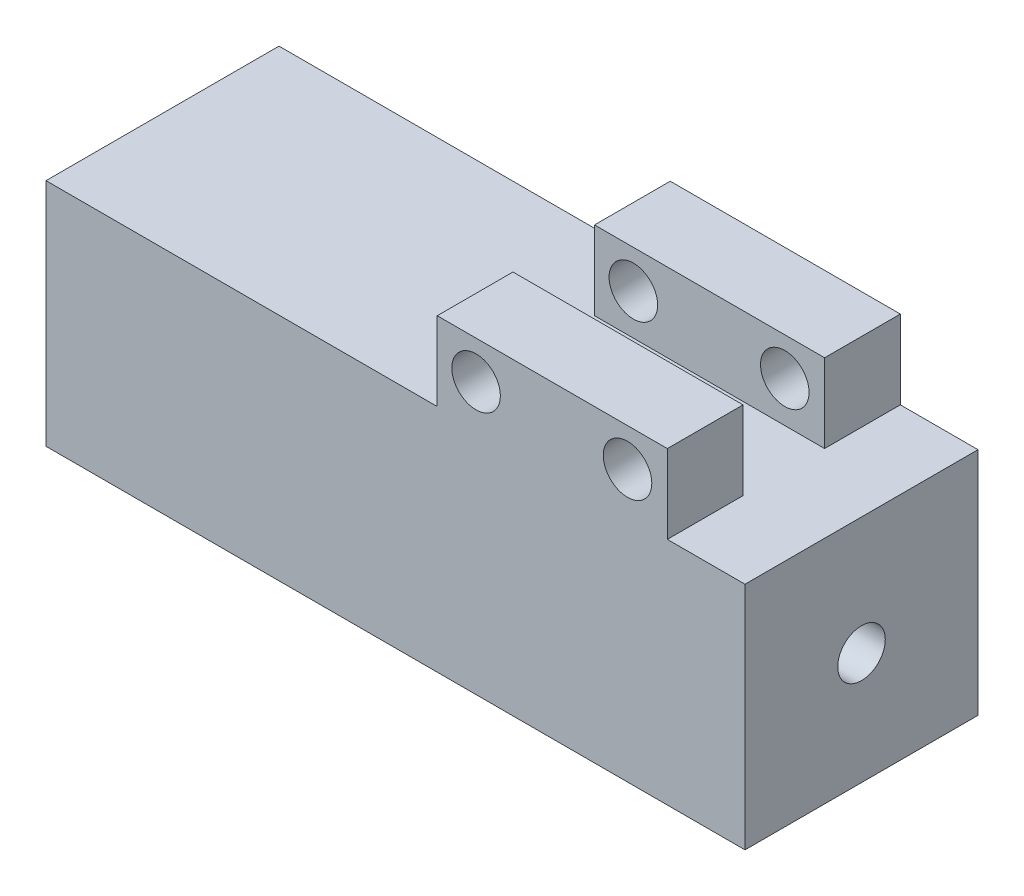
ISO-10303-21;
HEADER;
FILE_DESCRIPTION(('STEP AP214'),'2;1');
FILE_NAME('part.step','',(''),(''),'','','');
FILE_SCHEMA(('AUTOMOTIVE_DESIGN { 1 0 10303 214 1 1 1 1 }'));
ENDSEC;
DATA;
#1=APPLICATION_CONTEXT('core data for automotive mechanical design processes');
#2=APPLICATION_PROTOCOL_DEFINITION('international standard','automotive_design',2000,#1);
#3=PRODUCT_CONTEXT('',#1,'mechanical');
#4=PRODUCT('Part','Part','',(#3));
#5=PRODUCT_RELATED_PRODUCT_CATEGORY('part','',(#4));
#6=PRODUCT_DEFINITION_FORMATION('','',#4);
#7=PRODUCT_DEFINITION_CONTEXT('part definition',#1,'design');
#8=PRODUCT_DEFINITION('design','',#6,#7);
#9=PRODUCT_DEFINITION_SHAPE('','',#8);
#10=(LENGTH_UNIT() NAMED_UNIT(*) SI_UNIT(.MILLI.,.METRE.));
#11=(NAMED_UNIT(*) PLANE_ANGLE_UNIT() SI_UNIT($,.RADIAN.));
#12=(NAMED_UNIT(*) SI_UNIT($,.STERADIAN.) SOLID_ANGLE_UNIT());
#13=UNCERTAINTY_MEASURE_WITH_UNIT(LENGTH_MEASURE(1.E-05),#10,'distance_accuracy_value','');
#14=(GEOMETRIC_REPRESENTATION_CONTEXT(3) GLOBAL_UNCERTAINTY_ASSIGNED_CONTEXT((#13)) GLOBAL_UNIT_ASSIGNED_CONTEXT((#10,
#11,#12)) REPRESENTATION_CONTEXT('',''));
#15=CARTESIAN_POINT('',(0.,0.,0.));
#16=DIRECTION('',(0.,0.,1.));
#17=DIRECTION('',(1.,0.,0.));
#18=AXIS2_PLACEMENT_3D('',#15,#16,#17);
#19=CARTESIAN_POINT('',(-36.,11.85,12.));
#20=DIRECTION('',(0.,-1.,0.));
#21=DIRECTION('',(0.,0.,-1.));
#22=AXIS2_PLACEMENT_3D('',#19,#20,#21);
#23=PLANE('',#22);
#24=DIRECTION('',(0.,0.,1.));
#25=VECTOR('',#24,1.);
#26=CARTESIAN_POINT('',(4.3,11.85,-12.));
#27=LINE('',#26,#25);
#28=CARTESIAN_POINT('',(4.3,11.85,-12.));
#29=VERTEX_POINT('',#28);
#30=CARTESIAN_POINT('',(4.3,11.85,-4.2));
#31=VERTEX_POINT('',#30);
#32=EDGE_CURVE('E149',#29,#31,#27,.T.);
#33=ORIENTED_EDGE('',*,*,#32,.F.);
#34=DIRECTION('',(-1.,0.,0.));
#35=VECTOR('',#34,1.);
#36=CARTESIAN_POINT('',(-36.,11.85,-12.));
#37=LINE('',#36,#35);
#38=CARTESIAN_POINT('',(-36.,11.85,-12.));
#39=VERTEX_POINT('',#38);
#40=EDGE_CURVE('E134',#29,#39,#37,.T.);
#41=ORIENTED_EDGE('',*,*,#40,.T.);
#42=DIRECTION('',(0.,0.,-1.));
#43=VECTOR('',#42,1.);
#44=CARTESIAN_POINT('',(-36.,11.85,12.));
#45=LINE('',#44,#43);
#46=CARTESIAN_POINT('',(-36.,11.85,12.));
#47=VERTEX_POINT('',#46);
#48=EDGE_CURVE('E237',#47,#39,#45,.T.);
#49=ORIENTED_EDGE('',*,*,#48,.F.);
#50=DIRECTION('',(-1.,0.,0.));
#51=VECTOR('',#50,1.);
#52=CARTESIAN_POINT('',(-36.,11.85,12.));
#53=LINE('',#52,#51);
#54=CARTESIAN_POINT('',(4.3,11.85,12.));
#55=VERTEX_POINT('',#54);
#56=EDGE_CURVE('E232',#55,#47,#53,.T.);
#57=ORIENTED_EDGE('',*,*,#56,.F.);
#58=DIRECTION('',(0.,0.,1.));
#59=VECTOR('',#58,1.);
#60=CARTESIAN_POINT('',(4.3,11.85,12.));
#61=LINE('',#60,#59);
#62=CARTESIAN_POINT('',(4.3,11.85,4.2));
#63=VERTEX_POINT('',#62);
#64=EDGE_CURVE('E153',#63,#55,#61,.T.);
#65=ORIENTED_EDGE('',*,*,#64,.F.);
#66=DIRECTION('',(-1.,0.,0.));
#67=VECTOR('',#66,1.);
#68=CARTESIAN_POINT('',(4.3,11.85,4.2));
#69=LINE('',#68,#67);
#70=CARTESIAN_POINT('',(28.,11.85,4.2));
#71=VERTEX_POINT('',#70);
#72=EDGE_CURVE('E187',#71,#63,#69,.T.);
#73=ORIENTED_EDGE('',*,*,#72,.F.);
#74=DIRECTION('',(0.,0.,-1.));
#75=VECTOR('',#74,1.);
#76=CARTESIAN_POINT('',(28.,11.85,12.));
#77=LINE('',#76,#75);
#78=CARTESIAN_POINT('',(28.,11.85,12.));
#79=VERTEX_POINT('',#78);
#80=EDGE_CURVE('E200',#79,#71,#77,.T.);
#81=ORIENTED_EDGE('',*,*,#80,.F.);
#82=CARTESIAN_POINT('',(36.,11.85,12.));
#83=VERTEX_POINT('',#82);
#84=EDGE_CURVE('E233',#83,#79,#53,.T.);
#85=ORIENTED_EDGE('',*,*,#84,.F.);
#86=DIRECTION('',(0.,0.,-1.));
#87=VECTOR('',#86,1.);
#88=CARTESIAN_POINT('',(36.,11.85,12.));
#89=LINE('',#88,#87);
#90=CARTESIAN_POINT('',(36.,11.85,-12.));
#91=VERTEX_POINT('',#90);
#92=EDGE_CURVE('E248',#83,#91,#89,.T.);
#93=ORIENTED_EDGE('',*,*,#92,.T.);
#94=CARTESIAN_POINT('',(28.,11.85,-12.));
#95=VERTEX_POINT('',#94);
#96=EDGE_CURVE('E145',#91,#95,#37,.T.);
#97=ORIENTED_EDGE('',*,*,#96,.T.);
#98=DIRECTION('',(0.,0.,-1.));
#99=VECTOR('',#98,1.);
#100=CARTESIAN_POINT('',(28.,11.85,-12.));
#101=LINE('',#100,#99);
#102=CARTESIAN_POINT('',(28.,11.85,-4.2));
#103=VERTEX_POINT('',#102);
#104=EDGE_CURVE('E66',#103,#95,#101,.T.);
#105=ORIENTED_EDGE('',*,*,#104,.F.);
#106=DIRECTION('',(1.,0.,0.));
#107=VECTOR('',#106,1.);
#108=CARTESIAN_POINT('',(4.3,11.85,-4.2));
#109=LINE('',#108,#107);
#110=EDGE_CURVE('E61',#31,#103,#109,.T.);
#111=ORIENTED_EDGE('',*,*,#110,.F.);
#112=EDGE_LOOP('',(#33,#41,#49,#57,#65,#73,#81,#85,#93,#97,#105,#111));
#113=FACE_BOUND('',#112,.T.);
#114=ADVANCED_FACE('F43',(#113),#23,.F.);
#115=CARTESIAN_POINT('',(-36.,-11.85,12.));
#116=DIRECTION('',(1.,0.,0.));
#117=DIRECTION('',(0.,0.,-1.));
#118=AXIS2_PLACEMENT_3D('',#115,#116,#117);
#119=PLANE('',#118);
#120=DIRECTION('',(0.,-1.,0.));
#121=VECTOR('',#120,1.);
#122=CARTESIAN_POINT('',(-36.,-11.85,-12.));
#123=LINE('',#122,#121);
#124=CARTESIAN_POINT('',(-36.,-11.85,-12.));
#125=VERTEX_POINT('',#124);
#126=EDGE_CURVE('E141',#39,#125,#123,.T.);
#127=ORIENTED_EDGE('',*,*,#126,.T.);
#128=DIRECTION('',(0.,0.,-1.));
#129=VECTOR('',#128,1.);
#130=CARTESIAN_POINT('',(-36.,-11.85,12.));
#131=LINE('',#130,#129);
#132=CARTESIAN_POINT('',(-36.,-11.85,12.));
#133=VERTEX_POINT('',#132);
#134=EDGE_CURVE('E11',#133,#125,#131,.T.);
#135=ORIENTED_EDGE('',*,*,#134,.F.);
#136=DIRECTION('',(0.,-1.,0.));
#137=VECTOR('',#136,1.);
#138=CARTESIAN_POINT('',(-36.,-11.85,12.));
#139=LINE('',#138,#137);
#140=EDGE_CURVE('E222',#47,#133,#139,.T.);
#141=ORIENTED_EDGE('',*,*,#140,.F.);
#142=ORIENTED_EDGE('',*,*,#48,.T.);
#143=EDGE_LOOP('',(#127,#135,#141,#142));
#144=FACE_BOUND('',#143,.T.);
#145=ADVANCED_FACE('F45',(#144),#119,.F.);
#146=CARTESIAN_POINT('',(-36.,-11.85,12.));
#147=DIRECTION('',(0.,1.,0.));
#148=DIRECTION('',(0.,0.,1.));
#149=AXIS2_PLACEMENT_3D('',#146,#147,#148);
#150=PLANE('',#149);
#151=DIRECTION('',(1.,0.,0.));
#152=VECTOR('',#151,1.);
#153=CARTESIAN_POINT('',(-36.,-11.85,-12.));
#154=LINE('',#153,#152);
#155=CARTESIAN_POINT('',(36.,-11.85,-12.));
#156=VERTEX_POINT('',#155);
#157=EDGE_CURVE('E240',#125,#156,#154,.T.);
#158=ORIENTED_EDGE('',*,*,#157,.T.);
#159=DIRECTION('',(0.,0.,-1.));
#160=VECTOR('',#159,1.);
#161=CARTESIAN_POINT('',(36.,-11.85,12.));
#162=LINE('',#161,#160);
#163=CARTESIAN_POINT('',(36.,-11.85,12.));
#164=VERTEX_POINT('',#163);
#165=EDGE_CURVE('E53',#164,#156,#162,.T.);
#166=ORIENTED_EDGE('',*,*,#165,.F.);
#167=DIRECTION('',(1.,0.,0.));
#168=VECTOR('',#167,1.);
#169=CARTESIAN_POINT('',(-36.,-11.85,12.));
#170=LINE('',#169,#168);
#171=EDGE_CURVE('E226',#133,#164,#170,.T.);
#172=ORIENTED_EDGE('',*,*,#171,.F.);
#173=ORIENTED_EDGE('',*,*,#134,.T.);
#174=EDGE_LOOP('',(#158,#166,#172,#173));
#175=FACE_BOUND('',#174,.T.);
#176=ADVANCED_FACE('F316',(#175),#150,.F.);
#177=CARTESIAN_POINT('',(36.,-11.85,12.));
#178=DIRECTION('',(-1.,0.,0.));
#179=DIRECTION('',(0.,0.,1.));
#180=AXIS2_PLACEMENT_3D('',#177,#178,#179);
#181=PLANE('',#180);
#182=CARTESIAN_POINT('',(36.,-0.299999999999997,0.));
#183=DIRECTION('',(1.,0.,0.));
#184=DIRECTION('',(0.,0.,-1.));
#185=AXIS2_PLACEMENT_3D('',#182,#183,#184);
#186=CIRCLE('',#185,2.45);
#187=CARTESIAN_POINT('',(36.,-0.299999999999997,-2.45));
#188=VERTEX_POINT('',#187);
#189=EDGE_CURVE('E286',#188,#188,#186,.T.);
#190=ORIENTED_EDGE('',*,*,#189,.F.);
#191=EDGE_LOOP('',(#190));
#192=FACE_BOUND('',#191,.T.);
#193=DIRECTION('',(0.,1.,0.));
#194=VECTOR('',#193,1.);
#195=CARTESIAN_POINT('',(36.,-11.85,-12.));
#196=LINE('',#195,#194);
#197=EDGE_CURVE('E146',#156,#91,#196,.T.);
#198=ORIENTED_EDGE('',*,*,#197,.T.);
#199=ORIENTED_EDGE('',*,*,#92,.F.);
#200=DIRECTION('',(0.,1.,0.));
#201=VECTOR('',#200,1.);
#202=CARTESIAN_POINT('',(36.,-11.85,12.));
#203=LINE('',#202,#201);
#204=EDGE_CURVE('E229',#164,#83,#203,.T.);
#205=ORIENTED_EDGE('',*,*,#204,.F.);
#206=ORIENTED_EDGE('',*,*,#165,.T.);
#207=EDGE_LOOP('',(#198,#199,#205,#206));
#208=FACE_BOUND('',#207,.T.);
#209=ADVANCED_FACE('F313',(#192,#208),#181,.F.);
#210=CARTESIAN_POINT('',(0.,0.,12.));
#211=DIRECTION('',(0.,0.,-1.));
#212=DIRECTION('',(-1.,0.,0.));
#213=AXIS2_PLACEMENT_3D('',#210,#211,#212);
#214=PLANE('',#213);
#215=CARTESIAN_POINT('',(8.3,16.05,12.));
#216=DIRECTION('',(0.,0.,1.));
#217=DIRECTION('',(1.,0.,0.));
#218=AXIS2_PLACEMENT_3D('',#215,#216,#217);
#219=CIRCLE('',#218,2.5);
#220=CARTESIAN_POINT('',(10.8,16.05,12.));
#221=VERTEX_POINT('',#220);
#222=EDGE_CURVE('E266',#221,#221,#219,.T.);
#223=ORIENTED_EDGE('',*,*,#222,.F.);
#224=EDGE_LOOP('',(#223));
#225=FACE_BOUND('',#224,.T.);
#226=CARTESIAN_POINT('',(23.9,16.05,12.));
#227=DIRECTION('',(0.,0.,1.));
#228=DIRECTION('',(1.,0.,0.));
#229=AXIS2_PLACEMENT_3D('',#226,#227,#228);
#230=CIRCLE('',#229,2.5);
#231=CARTESIAN_POINT('',(26.4,16.05,12.));
#232=VERTEX_POINT('',#231);
#233=EDGE_CURVE('E272',#232,#232,#230,.T.);
#234=ORIENTED_EDGE('',*,*,#233,.F.);
#235=EDGE_LOOP('',(#234));
#236=FACE_BOUND('',#235,.T.);
#237=ORIENTED_EDGE('',*,*,#140,.T.);
#238=ORIENTED_EDGE('',*,*,#171,.T.);
#239=ORIENTED_EDGE('',*,*,#204,.T.);
#240=ORIENTED_EDGE('',*,*,#84,.T.);
#241=DIRECTION('',(0.,-1.,0.));
#242=VECTOR('',#241,1.);
#243=CARTESIAN_POINT('',(28.,19.95,12.));
#244=LINE('',#243,#242);
#245=CARTESIAN_POINT('',(28.,19.95,12.));
#246=VERTEX_POINT('',#245);
#247=EDGE_CURVE('E214',#246,#79,#244,.T.);
#248=ORIENTED_EDGE('',*,*,#247,.F.);
#249=DIRECTION('',(1.,0.,0.));
#250=VECTOR('',#249,1.);
#251=CARTESIAN_POINT('',(4.3,19.95,12.));
#252=LINE('',#251,#250);
#253=CARTESIAN_POINT('',(4.3,19.95,12.));
#254=VERTEX_POINT('',#253);
#255=EDGE_CURVE('E186',#254,#246,#252,.T.);
#256=ORIENTED_EDGE('',*,*,#255,.F.);
#257=DIRECTION('',(0.,-1.,0.));
#258=VECTOR('',#257,1.);
#259=CARTESIAN_POINT('',(4.3,19.95,12.));
#260=LINE('',#259,#258);
#261=EDGE_CURVE('E218',#254,#55,#260,.T.);
#262=ORIENTED_EDGE('',*,*,#261,.T.);
#263=ORIENTED_EDGE('',*,*,#56,.T.);
#264=EDGE_LOOP('',(#237,#238,#239,#240,#248,#256,#262,#263));
#265=FACE_BOUND('',#264,.T.);
#266=ADVANCED_FACE('F323',(#225,#236,#265),#214,.F.);
#267=CARTESIAN_POINT('',(0.,0.,-12.));
#268=DIRECTION('',(0.,0.,-1.));
#269=DIRECTION('',(-1.,0.,0.));
#270=AXIS2_PLACEMENT_3D('',#267,#268,#269);
#271=PLANE('',#270);
#272=CARTESIAN_POINT('',(8.3,16.05,-12.));
#273=DIRECTION('',(0.,0.,1.));
#274=DIRECTION('',(1.,0.,0.));
#275=AXIS2_PLACEMENT_3D('',#272,#273,#274);
#276=CIRCLE('',#275,2.5);
#277=CARTESIAN_POINT('',(10.8,16.05,-12.));
#278=VERTEX_POINT('',#277);
#279=EDGE_CURVE('E258',#278,#278,#276,.T.);
#280=ORIENTED_EDGE('',*,*,#279,.T.);
#281=EDGE_LOOP('',(#280));
#282=FACE_BOUND('',#281,.T.);
#283=CARTESIAN_POINT('',(23.9,16.05,-12.));
#284=DIRECTION('',(0.,0.,1.));
#285=DIRECTION('',(1.,0.,0.));
#286=AXIS2_PLACEMENT_3D('',#283,#284,#285);
#287=CIRCLE('',#286,2.5);
#288=CARTESIAN_POINT('',(26.4,16.05,-12.));
#289=VERTEX_POINT('',#288);
#290=EDGE_CURVE('E275',#289,#289,#287,.T.);
#291=ORIENTED_EDGE('',*,*,#290,.T.);
#292=EDGE_LOOP('',(#291));
#293=FACE_BOUND('',#292,.T.);
#294=ORIENTED_EDGE('',*,*,#126,.F.);
#295=ORIENTED_EDGE('',*,*,#40,.F.);
#296=DIRECTION('',(0.,-1.,0.));
#297=VECTOR('',#296,1.);
#298=CARTESIAN_POINT('',(4.3,19.95,-12.));
#299=LINE('',#298,#297);
#300=CARTESIAN_POINT('',(4.3,19.95,-12.));
#301=VERTEX_POINT('',#300);
#302=EDGE_CURVE('E138',#301,#29,#299,.T.);
#303=ORIENTED_EDGE('',*,*,#302,.F.);
#304=DIRECTION('',(-1.,0.,0.));
#305=VECTOR('',#304,1.);
#306=CARTESIAN_POINT('',(4.3,19.95,-12.));
#307=LINE('',#306,#305);
#308=CARTESIAN_POINT('',(28.,19.95,-12.));
#309=VERTEX_POINT('',#308);
#310=EDGE_CURVE('E159',#309,#301,#307,.T.);
#311=ORIENTED_EDGE('',*,*,#310,.F.);
#312=DIRECTION('',(0.,-1.,0.));
#313=VECTOR('',#312,1.);
#314=CARTESIAN_POINT('',(28.,19.95,-12.));
#315=LINE('',#314,#313);
#316=EDGE_CURVE('E160',#309,#95,#315,.T.);
#317=ORIENTED_EDGE('',*,*,#316,.T.);
#318=ORIENTED_EDGE('',*,*,#96,.F.);
#319=ORIENTED_EDGE('',*,*,#197,.F.);
#320=ORIENTED_EDGE('',*,*,#157,.F.);
#321=EDGE_LOOP('',(#294,#295,#303,#311,#317,#318,#319,#320));
#322=FACE_BOUND('',#321,.T.);
#323=ADVANCED_FACE('F135',(#282,#293,#322),#271,.T.);
#324=CARTESIAN_POINT('',(4.3,19.95,12.));
#325=DIRECTION('',(1.,0.,0.));
#326=DIRECTION('',(0.,0.,-1.));
#327=AXIS2_PLACEMENT_3D('',#324,#325,#326);
#328=PLANE('',#327);
#329=ORIENTED_EDGE('',*,*,#64,.T.);
#330=ORIENTED_EDGE('',*,*,#261,.F.);
#331=DIRECTION('',(0.,0.,1.));
#332=VECTOR('',#331,1.);
#333=CARTESIAN_POINT('',(4.3,19.95,12.));
#334=LINE('',#333,#332);
#335=CARTESIAN_POINT('',(4.3,19.95,4.2));
#336=VERTEX_POINT('',#335);
#337=EDGE_CURVE('E182',#336,#254,#334,.T.);
#338=ORIENTED_EDGE('',*,*,#337,.F.);
#339=DIRECTION('',(0.,-1.,0.));
#340=VECTOR('',#339,1.);
#341=CARTESIAN_POINT('',(4.3,19.95,4.2));
#342=LINE('',#341,#340);
#343=EDGE_CURVE('E196',#336,#63,#342,.T.);
#344=ORIENTED_EDGE('',*,*,#343,.T.);
#345=EDGE_LOOP('',(#329,#330,#338,#344));
#346=FACE_BOUND('',#345,.T.);
#347=ADVANCED_FACE('F327',(#346),#328,.F.);
#348=CARTESIAN_POINT('',(28.,19.95,12.));
#349=DIRECTION('',(-1.,0.,0.));
#350=DIRECTION('',(0.,0.,1.));
#351=AXIS2_PLACEMENT_3D('',#348,#349,#350);
#352=PLANE('',#351);
#353=ORIENTED_EDGE('',*,*,#80,.T.);
#354=DIRECTION('',(0.,-1.,0.));
#355=VECTOR('',#354,1.);
#356=CARTESIAN_POINT('',(28.,19.95,4.2));
#357=LINE('',#356,#355);
#358=CARTESIAN_POINT('',(28.,19.95,4.2));
#359=VERTEX_POINT('',#358);
#360=EDGE_CURVE('E210',#359,#71,#357,.T.);
#361=ORIENTED_EDGE('',*,*,#360,.F.);
#362=DIRECTION('',(0.,0.,-1.));
#363=VECTOR('',#362,1.);
#364=CARTESIAN_POINT('',(28.,19.95,12.));
#365=LINE('',#364,#363);
#366=EDGE_CURVE('E190',#246,#359,#365,.T.);
#367=ORIENTED_EDGE('',*,*,#366,.F.);
#368=ORIENTED_EDGE('',*,*,#247,.T.);
#369=EDGE_LOOP('',(#353,#361,#367,#368));
#370=FACE_BOUND('',#369,.T.);
#371=ADVANCED_FACE('F334',(#370),#352,.F.);
#372=CARTESIAN_POINT('',(4.3,19.95,4.2));
#373=DIRECTION('',(0.,0.,1.));
#374=DIRECTION('',(1.,0.,0.));
#375=AXIS2_PLACEMENT_3D('',#372,#373,#374);
#376=PLANE('',#375);
#377=CARTESIAN_POINT('',(8.3,16.05,4.2));
#378=DIRECTION('',(0.,0.,1.));
#379=DIRECTION('',(1.,0.,0.));
#380=AXIS2_PLACEMENT_3D('',#377,#378,#379);
#381=CIRCLE('',#380,2.5);
#382=CARTESIAN_POINT('',(10.8,16.05,4.2));
#383=VERTEX_POINT('',#382);
#384=EDGE_CURVE('E282',#383,#383,#381,.T.);
#385=ORIENTED_EDGE('',*,*,#384,.T.);
#386=EDGE_LOOP('',(#385));
#387=FACE_BOUND('',#386,.T.);
#388=CARTESIAN_POINT('',(23.9,16.05,4.2));
#389=DIRECTION('',(0.,0.,1.));
#390=DIRECTION('',(1.,0.,0.));
#391=AXIS2_PLACEMENT_3D('',#388,#389,#390);
#392=CIRCLE('',#391,2.5);
#393=CARTESIAN_POINT('',(26.4,16.05,4.2));
#394=VERTEX_POINT('',#393);
#395=EDGE_CURVE('E257',#394,#394,#392,.T.);
#396=ORIENTED_EDGE('',*,*,#395,.T.);
#397=EDGE_LOOP('',(#396));
#398=FACE_BOUND('',#397,.T.);
#399=ORIENTED_EDGE('',*,*,#72,.T.);
#400=ORIENTED_EDGE('',*,*,#343,.F.);
#401=DIRECTION('',(-1.,0.,0.));
#402=VECTOR('',#401,1.);
#403=CARTESIAN_POINT('',(4.3,19.95,4.2));
#404=LINE('',#403,#402);
#405=EDGE_CURVE('E193',#359,#336,#404,.T.);
#406=ORIENTED_EDGE('',*,*,#405,.F.);
#407=ORIENTED_EDGE('',*,*,#360,.T.);
#408=EDGE_LOOP('',(#399,#400,#406,#407));
#409=FACE_BOUND('',#408,.T.);
#410=ADVANCED_FACE('F331',(#387,#398,#409),#376,.F.);
#411=CARTESIAN_POINT('',(0.,19.95,0.));
#412=DIRECTION('',(0.,-1.,0.));
#413=DIRECTION('',(0.,0.,-1.));
#414=AXIS2_PLACEMENT_3D('',#411,#412,#413);
#415=PLANE('',#414);
#416=ORIENTED_EDGE('',*,*,#337,.T.);
#417=ORIENTED_EDGE('',*,*,#255,.T.);
#418=ORIENTED_EDGE('',*,*,#366,.T.);
#419=ORIENTED_EDGE('',*,*,#405,.T.);
#420=EDGE_LOOP('',(#416,#417,#418,#419));
#421=FACE_BOUND('',#420,.T.);
#422=ADVANCED_FACE('F337',(#421),#415,.F.);
#423=CARTESIAN_POINT('',(4.3,19.95,-12.));
#424=DIRECTION('',(1.,0.,0.));
#425=DIRECTION('',(0.,0.,-1.));
#426=AXIS2_PLACEMENT_3D('',#423,#424,#425);
#427=PLANE('',#426);
#428=ORIENTED_EDGE('',*,*,#32,.T.);
#429=DIRECTION('',(0.,-1.,0.));
#430=VECTOR('',#429,1.);
#431=CARTESIAN_POINT('',(4.3,19.95,-4.2));
#432=LINE('',#431,#430);
#433=CARTESIAN_POINT('',(4.3,19.95,-4.2));
#434=VERTEX_POINT('',#433);
#435=EDGE_CURVE('E291',#434,#31,#432,.T.);
#436=ORIENTED_EDGE('',*,*,#435,.F.);
#437=DIRECTION('',(0.,0.,1.));
#438=VECTOR('',#437,1.);
#439=CARTESIAN_POINT('',(4.3,19.95,-12.));
#440=LINE('',#439,#438);
#441=EDGE_CURVE('E157',#301,#434,#440,.T.);
#442=ORIENTED_EDGE('',*,*,#441,.F.);
#443=ORIENTED_EDGE('',*,*,#302,.T.);
#444=EDGE_LOOP('',(#428,#436,#442,#443));
#445=FACE_BOUND('',#444,.T.);
#446=ADVANCED_FACE('F155',(#445),#427,.F.);
#447=CARTESIAN_POINT('',(4.3,19.95,-4.2));
#448=DIRECTION('',(0.,0.,-1.));
#449=DIRECTION('',(-1.,0.,0.));
#450=AXIS2_PLACEMENT_3D('',#447,#448,#449);
#451=PLANE('',#450);
#452=CARTESIAN_POINT('',(8.3,16.05,-4.2));
#453=DIRECTION('',(0.,0.,-1.));
#454=DIRECTION('',(-1.,0.,0.));
#455=AXIS2_PLACEMENT_3D('',#452,#453,#454);
#456=CIRCLE('',#455,2.5);
#457=CARTESIAN_POINT('',(5.8,16.05,-4.2));
#458=VERTEX_POINT('',#457);
#459=EDGE_CURVE('E47',#458,#458,#456,.T.);
#460=ORIENTED_EDGE('',*,*,#459,.T.);
#461=EDGE_LOOP('',(#460));
#462=FACE_BOUND('',#461,.T.);
#463=CARTESIAN_POINT('',(23.9,16.05,-4.2));
#464=DIRECTION('',(0.,0.,-1.));
#465=DIRECTION('',(-1.,0.,0.));
#466=AXIS2_PLACEMENT_3D('',#463,#464,#465);
#467=CIRCLE('',#466,2.5);
#468=CARTESIAN_POINT('',(21.4,16.05,-4.2));
#469=VERTEX_POINT('',#468);
#470=EDGE_CURVE('E254',#469,#469,#467,.T.);
#471=ORIENTED_EDGE('',*,*,#470,.T.);
#472=EDGE_LOOP('',(#471));
#473=FACE_BOUND('',#472,.T.);
#474=ORIENTED_EDGE('',*,*,#110,.T.);
#475=DIRECTION('',(0.,-1.,0.));
#476=VECTOR('',#475,1.);
#477=CARTESIAN_POINT('',(28.,19.95,-4.2));
#478=LINE('',#477,#476);
#479=CARTESIAN_POINT('',(28.,19.95,-4.2));
#480=VERTEX_POINT('',#479);
#481=EDGE_CURVE('E167',#480,#103,#478,.T.);
#482=ORIENTED_EDGE('',*,*,#481,.F.);
#483=DIRECTION('',(1.,0.,0.));
#484=VECTOR('',#483,1.);
#485=CARTESIAN_POINT('',(4.3,19.95,-4.2));
#486=LINE('',#485,#484);
#487=EDGE_CURVE('E177',#434,#480,#486,.T.);
#488=ORIENTED_EDGE('',*,*,#487,.F.);
#489=ORIENTED_EDGE('',*,*,#435,.T.);
#490=EDGE_LOOP('',(#474,#482,#488,#489));
#491=FACE_BOUND('',#490,.T.);
#492=ADVANCED_FACE('F304',(#462,#473,#491),#451,.F.);
#493=CARTESIAN_POINT('',(28.,19.95,-12.));
#494=DIRECTION('',(-1.,0.,0.));
#495=DIRECTION('',(0.,0.,1.));
#496=AXIS2_PLACEMENT_3D('',#493,#494,#495);
#497=PLANE('',#496);
#498=ORIENTED_EDGE('',*,*,#104,.T.);
#499=ORIENTED_EDGE('',*,*,#316,.F.);
#500=DIRECTION('',(0.,0.,-1.));
#501=VECTOR('',#500,1.);
#502=CARTESIAN_POINT('',(28.,19.95,-12.));
#503=LINE('',#502,#501);
#504=EDGE_CURVE('E164',#480,#309,#503,.T.);
#505=ORIENTED_EDGE('',*,*,#504,.F.);
#506=ORIENTED_EDGE('',*,*,#481,.T.);
#507=EDGE_LOOP('',(#498,#499,#505,#506));
#508=FACE_BOUND('',#507,.T.);
#509=ADVANCED_FACE('F301',(#508),#497,.F.);
#510=CARTESIAN_POINT('',(0.,19.95,0.));
#511=DIRECTION('',(0.,1.,0.));
#512=DIRECTION('',(0.,0.,1.));
#513=AXIS2_PLACEMENT_3D('',#510,#511,#512);
#514=PLANE('',#513);
#515=ORIENTED_EDGE('',*,*,#441,.T.);
#516=ORIENTED_EDGE('',*,*,#487,.T.);
#517=ORIENTED_EDGE('',*,*,#504,.T.);
#518=ORIENTED_EDGE('',*,*,#310,.T.);
#519=EDGE_LOOP('',(#515,#516,#517,#518));
#520=FACE_BOUND('',#519,.T.);
#521=ADVANCED_FACE('F306',(#520),#514,.T.);
#522=CARTESIAN_POINT('',(-24.,-0.299999999999997,0.));
#523=DIRECTION('',(1.,0.,0.));
#524=DIRECTION('',(0.,0.,-1.));
#525=AXIS2_PLACEMENT_3D('',#522,#523,#524);
#526=CYLINDRICAL_SURFACE('',#525,2.45);
#527=CARTESIAN_POINT('',(-24.,-0.299999999999997,0.));
#528=DIRECTION('',(1.,0.,0.));
#529=DIRECTION('',(0.,0.,-1.));
#530=AXIS2_PLACEMENT_3D('',#527,#528,#529);
#531=CIRCLE('',#530,2.45);
#532=CARTESIAN_POINT('',(-24.,-0.299999999999997,-2.45));
#533=VERTEX_POINT('',#532);
#534=EDGE_CURVE('E287',#533,#533,#531,.T.);
#535=ORIENTED_EDGE('',*,*,#534,.F.);
#536=EDGE_LOOP('',(#535));
#537=FACE_BOUND('',#536,.T.);
#538=ORIENTED_EDGE('',*,*,#189,.T.);
#539=EDGE_LOOP('',(#538));
#540=FACE_BOUND('',#539,.T.);
#541=ADVANCED_FACE('F468',(#537,#540),#526,.F.);
#542=CARTESIAN_POINT('',(-24.,-0.299999999999997,0.));
#543=DIRECTION('',(1.,0.,0.));
#544=DIRECTION('',(0.,0.,-1.));
#545=AXIS2_PLACEMENT_3D('',#542,#543,#544);
#546=PLANE('',#545);
#547=ORIENTED_EDGE('',*,*,#534,.T.);
#548=EDGE_LOOP('',(#547));
#549=FACE_BOUND('',#548,.T.);
#550=ADVANCED_FACE('F423',(#549),#546,.T.);
#551=CARTESIAN_POINT('',(23.9,16.05,-12.));
#552=DIRECTION('',(0.,0.,1.));
#553=DIRECTION('',(1.,0.,0.));
#554=AXIS2_PLACEMENT_3D('',#551,#552,#553);
#555=CYLINDRICAL_SURFACE('',#554,2.5);
#556=ORIENTED_EDGE('',*,*,#290,.F.);
#557=EDGE_LOOP('',(#556));
#558=FACE_BOUND('',#557,.T.);
#559=ORIENTED_EDGE('',*,*,#470,.F.);
#560=EDGE_LOOP('',(#559));
#561=FACE_BOUND('',#560,.T.);
#562=ADVANCED_FACE('F417',(#558,#561),#555,.F.);
#563=CARTESIAN_POINT('',(8.3,16.05,-12.));
#564=DIRECTION('',(0.,0.,1.));
#565=DIRECTION('',(1.,0.,0.));
#566=AXIS2_PLACEMENT_3D('',#563,#564,#565);
#567=CYLINDRICAL_SURFACE('',#566,2.5);
#568=ORIENTED_EDGE('',*,*,#279,.F.);
#569=EDGE_LOOP('',(#568));
#570=FACE_BOUND('',#569,.T.);
#571=ORIENTED_EDGE('',*,*,#459,.F.);
#572=EDGE_LOOP('',(#571));
#573=FACE_BOUND('',#572,.T.);
#574=ADVANCED_FACE('F422',(#570,#573),#567,.F.);
#575=ORIENTED_EDGE('',*,*,#233,.T.);
#576=EDGE_LOOP('',(#575));
#577=FACE_BOUND('',#576,.T.);
#578=ORIENTED_EDGE('',*,*,#395,.F.);
#579=EDGE_LOOP('',(#578));
#580=FACE_BOUND('',#579,.T.);
#581=ADVANCED_FACE('F426',(#577,#580),#555,.F.);
#582=ORIENTED_EDGE('',*,*,#222,.T.);
#583=EDGE_LOOP('',(#582));
#584=FACE_BOUND('',#583,.T.);
#585=ORIENTED_EDGE('',*,*,#384,.F.);
#586=EDGE_LOOP('',(#585));
#587=FACE_BOUND('',#586,.T.);
#588=ADVANCED_FACE('F439',(#584,#587),#567,.F.);
#589=CLOSED_SHELL('',(#114,#145,#176,#209,#266,#323,#347,#371,#410,#422,#446,#492,#509,#521,
#541,#550,#562,#574,#581,#588));
#590=MANIFOLD_SOLID_BREP('B2',#589);
#591=ADVANCED_BREP_SHAPE_REPRESENTATION('',(#18,#590),#14);
#592=SHAPE_DEFINITION_REPRESENTATION(#9,#591);
ENDSEC;
END-ISO-10303-21;
